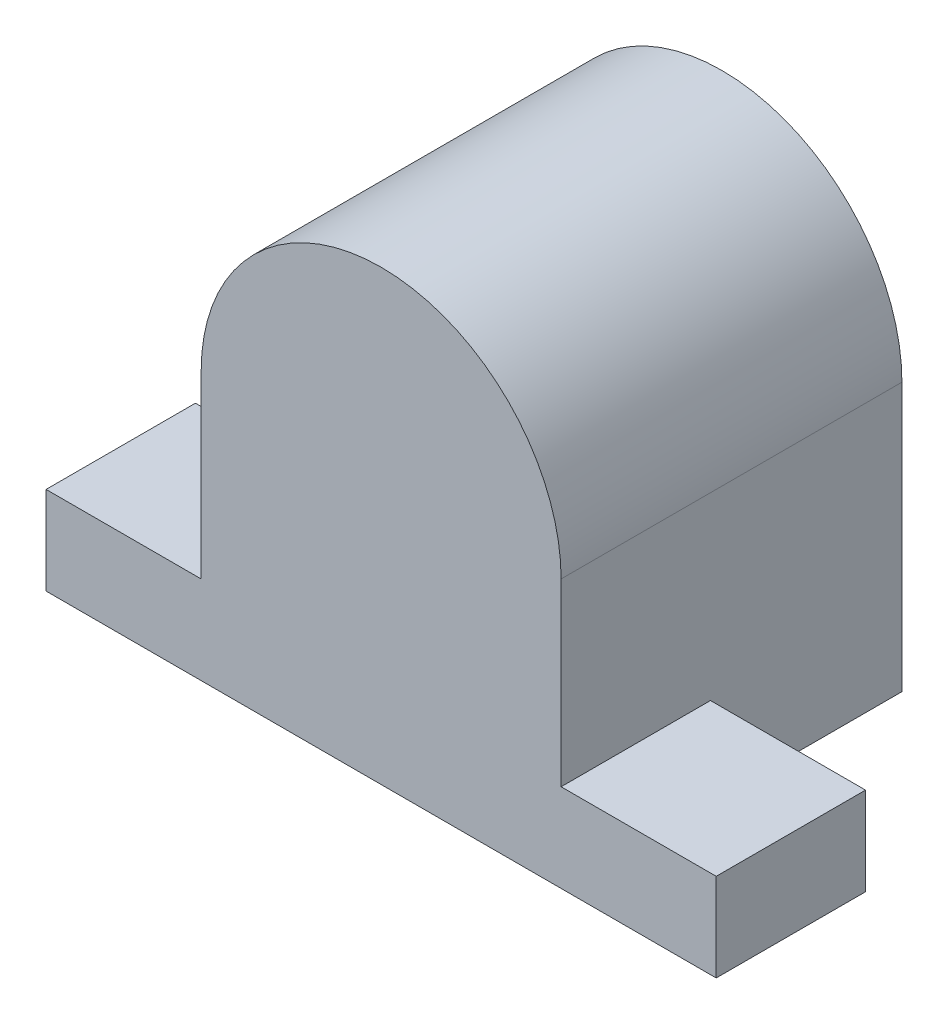
ISO-10303-21;
HEADER;
FILE_DESCRIPTION(('STEP AP214'),'2;1');
FILE_NAME('part.step','',(''),(''),'','','');
FILE_SCHEMA(('AUTOMOTIVE_DESIGN { 1 0 10303 214 1 1 1 1 }'));
ENDSEC;
DATA;
#1=APPLICATION_CONTEXT('core data for automotive mechanical design processes');
#2=APPLICATION_PROTOCOL_DEFINITION('international standard','automotive_design',2000,#1);
#3=PRODUCT_CONTEXT('',#1,'mechanical');
#4=PRODUCT('Part','Part','',(#3));
#5=PRODUCT_RELATED_PRODUCT_CATEGORY('part','',(#4));
#6=PRODUCT_DEFINITION_FORMATION('','',#4);
#7=PRODUCT_DEFINITION_CONTEXT('part definition',#1,'design');
#8=PRODUCT_DEFINITION('design','',#6,#7);
#9=PRODUCT_DEFINITION_SHAPE('','',#8);
#10=(LENGTH_UNIT() NAMED_UNIT(*) SI_UNIT(.MILLI.,.METRE.));
#11=(NAMED_UNIT(*) PLANE_ANGLE_UNIT() SI_UNIT($,.RADIAN.));
#12=(NAMED_UNIT(*) SI_UNIT($,.STERADIAN.) SOLID_ANGLE_UNIT());
#13=UNCERTAINTY_MEASURE_WITH_UNIT(LENGTH_MEASURE(1.E-05),#10,'distance_accuracy_value','');
#14=(GEOMETRIC_REPRESENTATION_CONTEXT(3) GLOBAL_UNCERTAINTY_ASSIGNED_CONTEXT((#13)) GLOBAL_UNIT_ASSIGNED_CONTEXT((#10,
#11,#12)) REPRESENTATION_CONTEXT('',''));
#15=CARTESIAN_POINT('',(0.,0.,0.));
#16=DIRECTION('',(0.,0.,1.));
#17=DIRECTION('',(1.,0.,0.));
#18=AXIS2_PLACEMENT_3D('',#15,#16,#17);
#19=CARTESIAN_POINT('',(0.,0.,0.));
#20=DIRECTION('',(0.,0.,1.));
#21=DIRECTION('',(1.,0.,0.));
#22=AXIS2_PLACEMENT_3D('',#19,#20,#21);
#23=PLANE('',#22);
#24=DIRECTION('',(0.,-1.,0.));
#25=VECTOR('',#24,1.);
#26=CARTESIAN_POINT('',(11.938,0.,0.));
#27=LINE('',#26,#25);
#28=CARTESIAN_POINT('',(11.938,-11.938,0.));
#29=VERTEX_POINT('',#28);
#30=CARTESIAN_POINT('',(11.938,-17.78,0.));
#31=VERTEX_POINT('',#30);
#32=EDGE_CURVE('E11',#29,#31,#27,.T.);
#33=ORIENTED_EDGE('',*,*,#32,.F.);
#34=DIRECTION('',(-1.,0.,0.));
#35=VECTOR('',#34,1.);
#36=CARTESIAN_POINT('',(11.938,-11.938,0.));
#37=LINE('',#36,#35);
#38=CARTESIAN_POINT('',(22.225,-11.938,0.));
#39=VERTEX_POINT('',#38);
#40=EDGE_CURVE('E128',#39,#29,#37,.T.);
#41=ORIENTED_EDGE('',*,*,#40,.F.);
#42=DIRECTION('',(0.,1.,0.));
#43=VECTOR('',#42,1.);
#44=CARTESIAN_POINT('',(22.225,-11.938,0.));
#45=LINE('',#44,#43);
#46=CARTESIAN_POINT('',(22.225,-17.78,0.));
#47=VERTEX_POINT('',#46);
#48=EDGE_CURVE('E55',#47,#39,#45,.T.);
#49=ORIENTED_EDGE('',*,*,#48,.F.);
#50=DIRECTION('',(1.,0.,0.));
#51=VECTOR('',#50,1.);
#52=CARTESIAN_POINT('',(22.225,-17.78,0.));
#53=LINE('',#52,#51);
#54=EDGE_CURVE('E63',#31,#47,#53,.T.);
#55=ORIENTED_EDGE('',*,*,#54,.F.);
#56=EDGE_LOOP('',(#33,#41,#49,#55));
#57=FACE_BOUND('',#56,.T.);
#58=ADVANCED_FACE('F39',(#57),#23,.F.);
#59=DIRECTION('',(0.,1.,0.));
#60=VECTOR('',#59,1.);
#61=CARTESIAN_POINT('',(-11.938,-17.78,0.));
#62=LINE('',#61,#60);
#63=CARTESIAN_POINT('',(-11.938,-17.78,0.));
#64=VERTEX_POINT('',#63);
#65=CARTESIAN_POINT('',(-11.938,-11.938,0.));
#66=VERTEX_POINT('',#65);
#67=EDGE_CURVE('E139',#64,#66,#62,.T.);
#68=ORIENTED_EDGE('',*,*,#67,.F.);
#69=CARTESIAN_POINT('',(-22.225,-17.78,0.));
#70=VERTEX_POINT('',#69);
#71=EDGE_CURVE('E189',#70,#64,#53,.T.);
#72=ORIENTED_EDGE('',*,*,#71,.F.);
#73=DIRECTION('',(0.,-1.,0.));
#74=VECTOR('',#73,1.);
#75=CARTESIAN_POINT('',(-22.225,-17.78,0.));
#76=LINE('',#75,#74);
#77=CARTESIAN_POINT('',(-22.225,-11.938,0.));
#78=VERTEX_POINT('',#77);
#79=EDGE_CURVE('E186',#78,#70,#76,.T.);
#80=ORIENTED_EDGE('',*,*,#79,.F.);
#81=DIRECTION('',(-1.,0.,0.));
#82=VECTOR('',#81,1.);
#83=CARTESIAN_POINT('',(-22.225,-11.938,0.));
#84=LINE('',#83,#82);
#85=EDGE_CURVE('E183',#66,#78,#84,.T.);
#86=ORIENTED_EDGE('',*,*,#85,.F.);
#87=EDGE_LOOP('',(#68,#72,#80,#86));
#88=FACE_BOUND('',#87,.T.);
#89=ADVANCED_FACE('F229',(#88),#23,.F.);
#90=CARTESIAN_POINT('',(0.,0.,3.556));
#91=DIRECTION('',(0.,0.,-1.));
#92=DIRECTION('',(-1.,0.,0.));
#93=AXIS2_PLACEMENT_3D('',#90,#91,#92);
#94=CYLINDRICAL_SURFACE('',#93,8.763);
#95=CARTESIAN_POINT('',(0.,0.,-9.144));
#96=DIRECTION('',(0.,0.,-1.));
#97=DIRECTION('',(-1.,0.,0.));
#98=AXIS2_PLACEMENT_3D('',#95,#96,#97);
#99=CIRCLE('',#98,8.763);
#100=CARTESIAN_POINT('',(-8.763,0.,-9.144));
#101=VERTEX_POINT('',#100);
#102=EDGE_CURVE('E48',#101,#101,#99,.T.);
#103=ORIENTED_EDGE('',*,*,#102,.F.);
#104=EDGE_LOOP('',(#103));
#105=FACE_BOUND('',#104,.T.);
#106=CARTESIAN_POINT('',(0.,0.,-12.7));
#107=DIRECTION('',(0.,0.,-1.));
#108=DIRECTION('',(-1.,0.,0.));
#109=AXIS2_PLACEMENT_3D('',#106,#107,#108);
#110=CIRCLE('',#109,8.763);
#111=CARTESIAN_POINT('',(-8.763,0.,-12.7));
#112=VERTEX_POINT('',#111);
#113=EDGE_CURVE('E147',#112,#112,#110,.T.);
#114=ORIENTED_EDGE('',*,*,#113,.T.);
#115=EDGE_LOOP('',(#114));
#116=FACE_BOUND('',#115,.T.);
#117=ADVANCED_FACE('F226',(#105,#116),#94,.F.);
#118=CARTESIAN_POINT('',(0.,0.,-12.7));
#119=DIRECTION('',(0.,0.,-1.));
#120=DIRECTION('',(-1.,0.,0.));
#121=AXIS2_PLACEMENT_3D('',#118,#119,#120);
#122=PLANE('',#121);
#123=CARTESIAN_POINT('',(0.,0.,-12.7));
#124=DIRECTION('',(0.,0.,-1.));
#125=DIRECTION('',(-1.,0.,0.));
#126=AXIS2_PLACEMENT_3D('',#123,#124,#125);
#127=CIRCLE('',#126,11.938);
#128=CARTESIAN_POINT('',(-11.938,0.,-12.7));
#129=VERTEX_POINT('',#128);
#130=CARTESIAN_POINT('',(11.938,0.,-12.7));
#131=VERTEX_POINT('',#130);
#132=EDGE_CURVE('E120',#129,#131,#127,.T.);
#133=ORIENTED_EDGE('',*,*,#132,.T.);
#134=DIRECTION('',(0.,-1.,0.));
#135=VECTOR('',#134,1.);
#136=CARTESIAN_POINT('',(11.938,0.,-12.7));
#137=LINE('',#136,#135);
#138=CARTESIAN_POINT('',(11.938,-17.78,-12.7));
#139=VERTEX_POINT('',#138);
#140=EDGE_CURVE('E131',#131,#139,#137,.T.);
#141=ORIENTED_EDGE('',*,*,#140,.T.);
#142=DIRECTION('',(-1.,0.,0.));
#143=VECTOR('',#142,1.);
#144=CARTESIAN_POINT('',(11.938,-17.78,-12.7));
#145=LINE('',#144,#143);
#146=CARTESIAN_POINT('',(-11.938,-17.78,-12.7));
#147=VERTEX_POINT('',#146);
#148=EDGE_CURVE('E138',#139,#147,#145,.T.);
#149=ORIENTED_EDGE('',*,*,#148,.T.);
#150=DIRECTION('',(0.,1.,0.));
#151=VECTOR('',#150,1.);
#152=CARTESIAN_POINT('',(-11.938,-17.78,-12.7));
#153=LINE('',#152,#151);
#154=EDGE_CURVE('E145',#147,#129,#153,.T.);
#155=ORIENTED_EDGE('',*,*,#154,.T.);
#156=EDGE_LOOP('',(#133,#141,#149,#155));
#157=FACE_BOUND('',#156,.T.);
#158=ORIENTED_EDGE('',*,*,#113,.F.);
#159=EDGE_LOOP('',(#158));
#160=FACE_BOUND('',#159,.T.);
#161=ADVANCED_FACE('F142',(#157,#160),#122,.T.);
#162=CARTESIAN_POINT('',(0.,0.,9.906));
#163=DIRECTION('',(0.,0.,1.));
#164=DIRECTION('',(1.,0.,0.));
#165=AXIS2_PLACEMENT_3D('',#162,#163,#164);
#166=PLANE('',#165);
#167=CARTESIAN_POINT('',(0.,0.,9.906));
#168=DIRECTION('',(0.,0.,1.));
#169=DIRECTION('',(1.,0.,0.));
#170=AXIS2_PLACEMENT_3D('',#167,#168,#169);
#171=CIRCLE('',#170,11.938);
#172=CARTESIAN_POINT('',(11.938,0.,9.906));
#173=VERTEX_POINT('',#172);
#174=CARTESIAN_POINT('',(-11.938,0.,9.906));
#175=VERTEX_POINT('',#174);
#176=EDGE_CURVE('E122',#173,#175,#171,.T.);
#177=ORIENTED_EDGE('',*,*,#176,.T.);
#178=DIRECTION('',(0.,-1.,0.));
#179=VECTOR('',#178,1.);
#180=CARTESIAN_POINT('',(-11.938,0.,9.906));
#181=LINE('',#180,#179);
#182=CARTESIAN_POINT('',(-11.938,-11.938,9.906));
#183=VERTEX_POINT('',#182);
#184=EDGE_CURVE('E151',#175,#183,#181,.T.);
#185=ORIENTED_EDGE('',*,*,#184,.T.);
#186=DIRECTION('',(-1.,0.,0.));
#187=VECTOR('',#186,1.);
#188=CARTESIAN_POINT('',(-11.938,-11.938,9.906));
#189=LINE('',#188,#187);
#190=CARTESIAN_POINT('',(-22.225,-11.938,9.906));
#191=VERTEX_POINT('',#190);
#192=EDGE_CURVE('E160',#183,#191,#189,.T.);
#193=ORIENTED_EDGE('',*,*,#192,.T.);
#194=DIRECTION('',(0.,-1.,0.));
#195=VECTOR('',#194,1.);
#196=CARTESIAN_POINT('',(-22.225,-11.938,9.906));
#197=LINE('',#196,#195);
#198=CARTESIAN_POINT('',(-22.225,-17.78,9.906));
#199=VERTEX_POINT('',#198);
#200=EDGE_CURVE('E164',#191,#199,#197,.T.);
#201=ORIENTED_EDGE('',*,*,#200,.T.);
#202=DIRECTION('',(1.,0.,0.));
#203=VECTOR('',#202,1.);
#204=CARTESIAN_POINT('',(-22.225,-17.78,9.906));
#205=LINE('',#204,#203);
#206=CARTESIAN_POINT('',(22.225,-17.78,9.906));
#207=VERTEX_POINT('',#206);
#208=EDGE_CURVE('E168',#199,#207,#205,.T.);
#209=ORIENTED_EDGE('',*,*,#208,.T.);
#210=DIRECTION('',(0.,1.,0.));
#211=VECTOR('',#210,1.);
#212=CARTESIAN_POINT('',(22.225,-17.78,9.906));
#213=LINE('',#212,#211);
#214=CARTESIAN_POINT('',(22.225,-11.938,9.906));
#215=VERTEX_POINT('',#214);
#216=EDGE_CURVE('E172',#207,#215,#213,.T.);
#217=ORIENTED_EDGE('',*,*,#216,.T.);
#218=DIRECTION('',(-1.,0.,0.));
#219=VECTOR('',#218,1.);
#220=CARTESIAN_POINT('',(22.225,-11.938,9.906));
#221=LINE('',#220,#219);
#222=CARTESIAN_POINT('',(11.938,-11.938,9.906));
#223=VERTEX_POINT('',#222);
#224=EDGE_CURVE('E176',#215,#223,#221,.T.);
#225=ORIENTED_EDGE('',*,*,#224,.T.);
#226=DIRECTION('',(0.,1.,0.));
#227=VECTOR('',#226,1.);
#228=CARTESIAN_POINT('',(11.938,-11.938,9.906));
#229=LINE('',#228,#227);
#230=EDGE_CURVE('E180',#223,#173,#229,.T.);
#231=ORIENTED_EDGE('',*,*,#230,.T.);
#232=EDGE_LOOP('',(#177,#185,#193,#201,#209,#217,#225,#231));
#233=FACE_BOUND('',#232,.T.);
#234=ADVANCED_FACE('F233',(#233),#166,.T.);
#235=CARTESIAN_POINT('',(-11.938,-11.938,3.556));
#236=DIRECTION('',(1.,0.,0.));
#237=DIRECTION('',(0.,0.,-1.));
#238=AXIS2_PLACEMENT_3D('',#235,#236,#237);
#239=PLANE('',#238);
#240=DIRECTION('',(0.,0.,-1.));
#241=VECTOR('',#240,1.);
#242=CARTESIAN_POINT('',(-11.938,0.,3.556));
#243=LINE('',#242,#241);
#244=EDGE_CURVE('E218',#175,#129,#243,.T.);
#245=ORIENTED_EDGE('',*,*,#244,.T.);
#246=ORIENTED_EDGE('',*,*,#154,.F.);
#247=DIRECTION('',(0.,0.,1.));
#248=VECTOR('',#247,1.);
#249=CARTESIAN_POINT('',(-11.938,-17.78,-12.7));
#250=LINE('',#249,#248);
#251=EDGE_CURVE('E291',#147,#64,#250,.T.);
#252=ORIENTED_EDGE('',*,*,#251,.T.);
#253=ORIENTED_EDGE('',*,*,#67,.T.);
#254=DIRECTION('',(0.,0.,-1.));
#255=VECTOR('',#254,1.);
#256=CARTESIAN_POINT('',(-11.938,-11.938,3.556));
#257=LINE('',#256,#255);
#258=EDGE_CURVE('E214',#183,#66,#257,.T.);
#259=ORIENTED_EDGE('',*,*,#258,.F.);
#260=ORIENTED_EDGE('',*,*,#184,.F.);
#261=EDGE_LOOP('',(#245,#246,#252,#253,#259,#260));
#262=FACE_BOUND('',#261,.T.);
#263=ADVANCED_FACE('F238',(#262),#239,.F.);
#264=CARTESIAN_POINT('',(-22.225,-11.938,3.556));
#265=DIRECTION('',(0.,-1.,0.));
#266=DIRECTION('',(0.,0.,-1.));
#267=AXIS2_PLACEMENT_3D('',#264,#265,#266);
#268=PLANE('',#267);
#269=ORIENTED_EDGE('',*,*,#85,.T.);
#270=DIRECTION('',(0.,0.,-1.));
#271=VECTOR('',#270,1.);
#272=CARTESIAN_POINT('',(-22.225,-11.938,3.556));
#273=LINE('',#272,#271);
#274=EDGE_CURVE('E210',#191,#78,#273,.T.);
#275=ORIENTED_EDGE('',*,*,#274,.F.);
#276=ORIENTED_EDGE('',*,*,#192,.F.);
#277=ORIENTED_EDGE('',*,*,#258,.T.);
#278=EDGE_LOOP('',(#269,#275,#276,#277));
#279=FACE_BOUND('',#278,.T.);
#280=ADVANCED_FACE('F265',(#279),#268,.F.);
#281=CARTESIAN_POINT('',(-22.225,-17.78,3.556));
#282=DIRECTION('',(1.,0.,0.));
#283=DIRECTION('',(0.,0.,-1.));
#284=AXIS2_PLACEMENT_3D('',#281,#282,#283);
#285=PLANE('',#284);
#286=ORIENTED_EDGE('',*,*,#79,.T.);
#287=DIRECTION('',(0.,0.,-1.));
#288=VECTOR('',#287,1.);
#289=CARTESIAN_POINT('',(-22.225,-17.78,3.556));
#290=LINE('',#289,#288);
#291=EDGE_CURVE('E206',#199,#70,#290,.T.);
#292=ORIENTED_EDGE('',*,*,#291,.F.);
#293=ORIENTED_EDGE('',*,*,#200,.F.);
#294=ORIENTED_EDGE('',*,*,#274,.T.);
#295=EDGE_LOOP('',(#286,#292,#293,#294));
#296=FACE_BOUND('',#295,.T.);
#297=ADVANCED_FACE('F262',(#296),#285,.F.);
#298=CARTESIAN_POINT('',(22.225,-17.78,3.556));
#299=DIRECTION('',(0.,1.,0.));
#300=DIRECTION('',(-1.,0.,0.));
#301=AXIS2_PLACEMENT_3D('',#298,#299,#300);
#302=PLANE('',#301);
#303=ORIENTED_EDGE('',*,*,#71,.T.);
#304=ORIENTED_EDGE('',*,*,#251,.F.);
#305=ORIENTED_EDGE('',*,*,#148,.F.);
#306=DIRECTION('',(0.,0.,1.));
#307=VECTOR('',#306,1.);
#308=CARTESIAN_POINT('',(11.938,-17.78,-12.7));
#309=LINE('',#308,#307);
#310=EDGE_CURVE('E134',#139,#31,#309,.T.);
#311=ORIENTED_EDGE('',*,*,#310,.T.);
#312=ORIENTED_EDGE('',*,*,#54,.T.);
#313=DIRECTION('',(0.,0.,-1.));
#314=VECTOR('',#313,1.);
#315=CARTESIAN_POINT('',(22.225,-17.78,3.556));
#316=LINE('',#315,#314);
#317=EDGE_CURVE('E203',#207,#47,#316,.T.);
#318=ORIENTED_EDGE('',*,*,#317,.F.);
#319=ORIENTED_EDGE('',*,*,#208,.F.);
#320=ORIENTED_EDGE('',*,*,#291,.T.);
#321=EDGE_LOOP('',(#303,#304,#305,#311,#312,#318,#319,#320));
#322=FACE_BOUND('',#321,.T.);
#323=ADVANCED_FACE('F259',(#322),#302,.F.);
#324=CARTESIAN_POINT('',(22.225,-11.938,3.556));
#325=DIRECTION('',(-1.,0.,0.));
#326=DIRECTION('',(0.,-1.,0.));
#327=AXIS2_PLACEMENT_3D('',#324,#325,#326);
#328=PLANE('',#327);
#329=ORIENTED_EDGE('',*,*,#48,.T.);
#330=DIRECTION('',(0.,0.,-1.));
#331=VECTOR('',#330,1.);
#332=CARTESIAN_POINT('',(22.225,-11.938,3.556));
#333=LINE('',#332,#331);
#334=EDGE_CURVE('E200',#215,#39,#333,.T.);
#335=ORIENTED_EDGE('',*,*,#334,.F.);
#336=ORIENTED_EDGE('',*,*,#216,.F.);
#337=ORIENTED_EDGE('',*,*,#317,.T.);
#338=EDGE_LOOP('',(#329,#335,#336,#337));
#339=FACE_BOUND('',#338,.T.);
#340=ADVANCED_FACE('F255',(#339),#328,.F.);
#341=CARTESIAN_POINT('',(11.938,-11.938,3.556));
#342=DIRECTION('',(0.,-1.,0.));
#343=DIRECTION('',(1.,0.,0.));
#344=AXIS2_PLACEMENT_3D('',#341,#342,#343);
#345=PLANE('',#344);
#346=ORIENTED_EDGE('',*,*,#40,.T.);
#347=DIRECTION('',(0.,0.,-1.));
#348=VECTOR('',#347,1.);
#349=CARTESIAN_POINT('',(11.938,-11.938,3.556));
#350=LINE('',#349,#348);
#351=EDGE_CURVE('E127',#223,#29,#350,.T.);
#352=ORIENTED_EDGE('',*,*,#351,.F.);
#353=ORIENTED_EDGE('',*,*,#224,.F.);
#354=ORIENTED_EDGE('',*,*,#334,.T.);
#355=EDGE_LOOP('',(#346,#352,#353,#354));
#356=FACE_BOUND('',#355,.T.);
#357=ADVANCED_FACE('F252',(#356),#345,.F.);
#358=CARTESIAN_POINT('',(0.,0.,3.556));
#359=DIRECTION('',(0.,0.,-1.));
#360=DIRECTION('',(-1.,0.,0.));
#361=AXIS2_PLACEMENT_3D('',#358,#359,#360);
#362=CYLINDRICAL_SURFACE('',#361,11.938);
#363=DIRECTION('',(0.,0.,-1.));
#364=VECTOR('',#363,1.);
#365=CARTESIAN_POINT('',(11.938,0.,3.556));
#366=LINE('',#365,#364);
#367=EDGE_CURVE('E117',#173,#131,#366,.T.);
#368=ORIENTED_EDGE('',*,*,#367,.T.);
#369=ORIENTED_EDGE('',*,*,#132,.F.);
#370=ORIENTED_EDGE('',*,*,#244,.F.);
#371=ORIENTED_EDGE('',*,*,#176,.F.);
#372=EDGE_LOOP('',(#368,#369,#370,#371));
#373=FACE_BOUND('',#372,.T.);
#374=ADVANCED_FACE('F41',(#373),#362,.T.);
#375=CARTESIAN_POINT('',(11.938,0.,3.556));
#376=DIRECTION('',(-1.,0.,0.));
#377=DIRECTION('',(0.,-1.,0.));
#378=AXIS2_PLACEMENT_3D('',#375,#376,#377);
#379=PLANE('',#378);
#380=ORIENTED_EDGE('',*,*,#351,.T.);
#381=ORIENTED_EDGE('',*,*,#32,.T.);
#382=ORIENTED_EDGE('',*,*,#310,.F.);
#383=ORIENTED_EDGE('',*,*,#140,.F.);
#384=ORIENTED_EDGE('',*,*,#367,.F.);
#385=ORIENTED_EDGE('',*,*,#230,.F.);
#386=EDGE_LOOP('',(#380,#381,#382,#383,#384,#385));
#387=FACE_BOUND('',#386,.T.);
#388=ADVANCED_FACE('F133',(#387),#379,.F.);
#389=CARTESIAN_POINT('',(0.,0.,-9.144));
#390=DIRECTION('',(0.,0.,-1.));
#391=DIRECTION('',(-1.,0.,0.));
#392=AXIS2_PLACEMENT_3D('',#389,#390,#391);
#393=PLANE('',#392);
#394=ORIENTED_EDGE('',*,*,#102,.T.);
#395=EDGE_LOOP('',(#394));
#396=FACE_BOUND('',#395,.T.);
#397=ADVANCED_FACE('F224',(#396),#393,.T.);
#398=CLOSED_SHELL('',(#58,#89,#117,#161,#234,#263,#280,#297,#323,#340,#357,#374,#388,#397));
#399=MANIFOLD_SOLID_BREP('B2',#398);
#400=ADVANCED_BREP_SHAPE_REPRESENTATION('',(#18,#399),#14);
#401=SHAPE_DEFINITION_REPRESENTATION(#9,#400);
ENDSEC;
END-ISO-10303-21;
